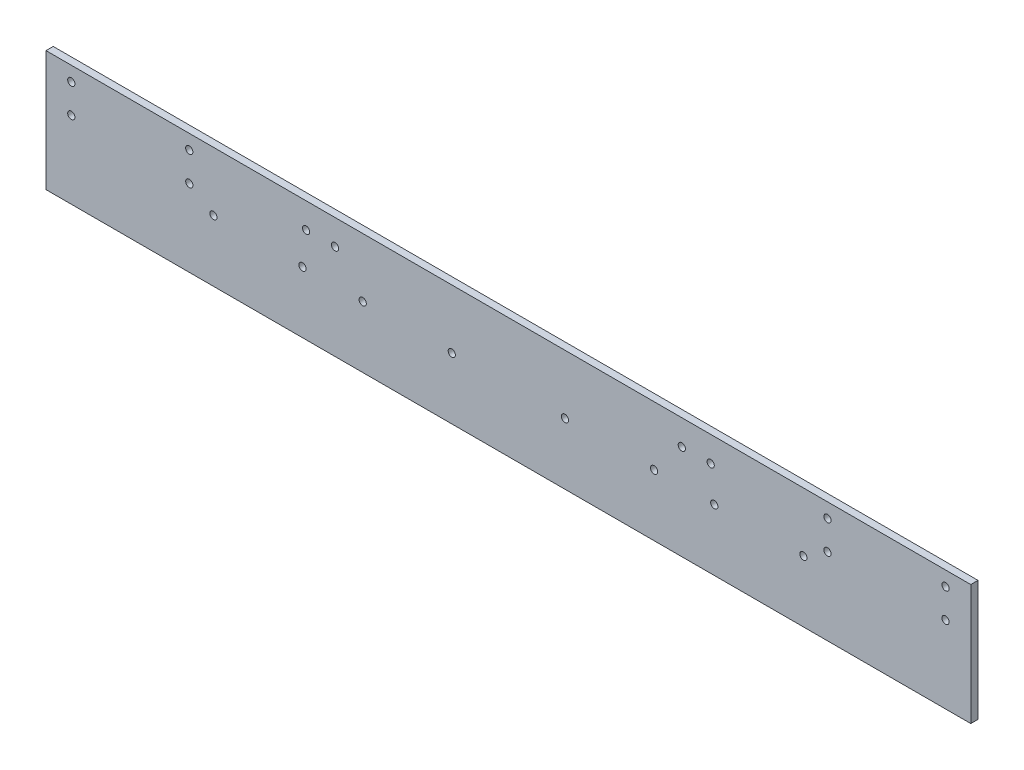
ISO-10303-21;
HEADER;
FILE_DESCRIPTION(('STEP AP214'),'2;1');
FILE_NAME('part.step','',(''),(''),'','','');
FILE_SCHEMA(('AUTOMOTIVE_DESIGN { 1 0 10303 214 1 1 1 1 }'));
ENDSEC;
DATA;
#1=APPLICATION_CONTEXT('core data for automotive mechanical design processes');
#2=APPLICATION_PROTOCOL_DEFINITION('international standard','automotive_design',2000,#1);
#3=PRODUCT_CONTEXT('',#1,'mechanical');
#4=PRODUCT('Part','Part','',(#3));
#5=PRODUCT_RELATED_PRODUCT_CATEGORY('part','',(#4));
#6=PRODUCT_DEFINITION_FORMATION('','',#4);
#7=PRODUCT_DEFINITION_CONTEXT('part definition',#1,'design');
#8=PRODUCT_DEFINITION('design','',#6,#7);
#9=PRODUCT_DEFINITION_SHAPE('','',#8);
#10=(LENGTH_UNIT() NAMED_UNIT(*) SI_UNIT(.MILLI.,.METRE.));
#11=(NAMED_UNIT(*) PLANE_ANGLE_UNIT() SI_UNIT($,.RADIAN.));
#12=(NAMED_UNIT(*) SI_UNIT($,.STERADIAN.) SOLID_ANGLE_UNIT());
#13=UNCERTAINTY_MEASURE_WITH_UNIT(LENGTH_MEASURE(1.E-05),#10,'distance_accuracy_value','');
#14=(GEOMETRIC_REPRESENTATION_CONTEXT(3) GLOBAL_UNCERTAINTY_ASSIGNED_CONTEXT((#13)) GLOBAL_UNIT_ASSIGNED_CONTEXT((#10,
#11,#12)) REPRESENTATION_CONTEXT('',''));
#15=CARTESIAN_POINT('',(0.,0.,0.));
#16=DIRECTION('',(0.,0.,1.));
#17=DIRECTION('',(1.,0.,0.));
#18=AXIS2_PLACEMENT_3D('',#15,#16,#17);
#19=CARTESIAN_POINT('',(0.,0.,3.));
#20=DIRECTION('',(1.,0.,0.));
#21=DIRECTION('',(0.,0.,-1.));
#22=AXIS2_PLACEMENT_3D('',#19,#20,#21);
#23=PLANE('',#22);
#24=DIRECTION('',(0.,-1.,0.));
#25=VECTOR('',#24,1.);
#26=CARTESIAN_POINT('',(0.,0.,0.));
#27=LINE('',#26,#25);
#28=CARTESIAN_POINT('',(0.,50.,0.));
#29=VERTEX_POINT('',#28);
#30=CARTESIAN_POINT('',(0.,0.,0.));
#31=VERTEX_POINT('',#30);
#32=EDGE_CURVE('E97',#29,#31,#27,.T.);
#33=ORIENTED_EDGE('',*,*,#32,.T.);
#34=DIRECTION('',(0.,0.,-1.));
#35=VECTOR('',#34,1.);
#36=CARTESIAN_POINT('',(0.,0.,3.));
#37=LINE('',#36,#35);
#38=CARTESIAN_POINT('',(0.,0.,3.));
#39=VERTEX_POINT('',#38);
#40=EDGE_CURVE('E11',#39,#31,#37,.T.);
#41=ORIENTED_EDGE('',*,*,#40,.F.);
#42=DIRECTION('',(0.,-1.,0.));
#43=VECTOR('',#42,1.);
#44=CARTESIAN_POINT('',(0.,0.,3.));
#45=LINE('',#44,#43);
#46=CARTESIAN_POINT('',(0.,50.,3.));
#47=VERTEX_POINT('',#46);
#48=EDGE_CURVE('E85',#47,#39,#45,.T.);
#49=ORIENTED_EDGE('',*,*,#48,.F.);
#50=DIRECTION('',(0.,0.,-1.));
#51=VECTOR('',#50,1.);
#52=CARTESIAN_POINT('',(0.,50.,3.));
#53=LINE('',#52,#51);
#54=EDGE_CURVE('E93',#47,#29,#53,.T.);
#55=ORIENTED_EDGE('',*,*,#54,.T.);
#56=EDGE_LOOP('',(#33,#41,#49,#55));
#57=FACE_BOUND('',#56,.T.);
#58=ADVANCED_FACE('F34',(#57),#23,.F.);
#59=CARTESIAN_POINT('',(0.,0.,3.));
#60=DIRECTION('',(0.,1.,0.));
#61=DIRECTION('',(0.,0.,1.));
#62=AXIS2_PLACEMENT_3D('',#59,#60,#61);
#63=PLANE('',#62);
#64=DIRECTION('',(1.,0.,0.));
#65=VECTOR('',#64,1.);
#66=CARTESIAN_POINT('',(0.,0.,0.));
#67=LINE('',#66,#65);
#68=CARTESIAN_POINT('',(384.,0.,0.));
#69=VERTEX_POINT('',#68);
#70=EDGE_CURVE('E89',#31,#69,#67,.T.);
#71=ORIENTED_EDGE('',*,*,#70,.T.);
#72=DIRECTION('',(0.,0.,-1.));
#73=VECTOR('',#72,1.);
#74=CARTESIAN_POINT('',(384.,0.,3.));
#75=LINE('',#74,#73);
#76=CARTESIAN_POINT('',(384.,0.,3.));
#77=VERTEX_POINT('',#76);
#78=EDGE_CURVE('E42',#77,#69,#75,.T.);
#79=ORIENTED_EDGE('',*,*,#78,.F.);
#80=DIRECTION('',(1.,0.,0.));
#81=VECTOR('',#80,1.);
#82=CARTESIAN_POINT('',(0.,0.,3.));
#83=LINE('',#82,#81);
#84=EDGE_CURVE('E80',#39,#77,#83,.T.);
#85=ORIENTED_EDGE('',*,*,#84,.F.);
#86=ORIENTED_EDGE('',*,*,#40,.T.);
#87=EDGE_LOOP('',(#71,#79,#85,#86));
#88=FACE_BOUND('',#87,.T.);
#89=ADVANCED_FACE('F88',(#88),#63,.F.);
#90=CARTESIAN_POINT('',(384.,0.,3.));
#91=DIRECTION('',(-1.,0.,0.));
#92=DIRECTION('',(0.,0.,1.));
#93=AXIS2_PLACEMENT_3D('',#90,#91,#92);
#94=PLANE('',#93);
#95=DIRECTION('',(0.,1.,0.));
#96=VECTOR('',#95,1.);
#97=CARTESIAN_POINT('',(384.,0.,0.));
#98=LINE('',#97,#96);
#99=CARTESIAN_POINT('',(384.,50.,0.));
#100=VERTEX_POINT('',#99);
#101=EDGE_CURVE('E67',#69,#100,#98,.T.);
#102=ORIENTED_EDGE('',*,*,#101,.T.);
#103=DIRECTION('',(0.,0.,-1.));
#104=VECTOR('',#103,1.);
#105=CARTESIAN_POINT('',(384.,50.,3.));
#106=LINE('',#105,#104);
#107=CARTESIAN_POINT('',(384.,50.,3.));
#108=VERTEX_POINT('',#107);
#109=EDGE_CURVE('E90',#108,#100,#106,.T.);
#110=ORIENTED_EDGE('',*,*,#109,.F.);
#111=DIRECTION('',(0.,1.,0.));
#112=VECTOR('',#111,1.);
#113=CARTESIAN_POINT('',(384.,0.,3.));
#114=LINE('',#113,#112);
#115=EDGE_CURVE('E83',#77,#108,#114,.T.);
#116=ORIENTED_EDGE('',*,*,#115,.F.);
#117=ORIENTED_EDGE('',*,*,#78,.T.);
#118=EDGE_LOOP('',(#102,#110,#116,#117));
#119=FACE_BOUND('',#118,.T.);
#120=ADVANCED_FACE('F91',(#119),#94,.F.);
#121=CARTESIAN_POINT('',(0.,50.,3.));
#122=DIRECTION('',(0.,-1.,0.));
#123=DIRECTION('',(1.,0.,0.));
#124=AXIS2_PLACEMENT_3D('',#121,#122,#123);
#125=PLANE('',#124);
#126=DIRECTION('',(-1.,0.,0.));
#127=VECTOR('',#126,1.);
#128=CARTESIAN_POINT('',(0.,50.,0.));
#129=LINE('',#128,#127);
#130=EDGE_CURVE('E73',#100,#29,#129,.T.);
#131=ORIENTED_EDGE('',*,*,#130,.T.);
#132=ORIENTED_EDGE('',*,*,#54,.F.);
#133=DIRECTION('',(-1.,0.,0.));
#134=VECTOR('',#133,1.);
#135=CARTESIAN_POINT('',(0.,50.,3.));
#136=LINE('',#135,#134);
#137=EDGE_CURVE('E50',#108,#47,#136,.T.);
#138=ORIENTED_EDGE('',*,*,#137,.F.);
#139=ORIENTED_EDGE('',*,*,#109,.T.);
#140=EDGE_LOOP('',(#131,#132,#138,#139));
#141=FACE_BOUND('',#140,.T.);
#142=ADVANCED_FACE('F105',(#141),#125,.F.);
#143=CARTESIAN_POINT('',(0.,0.,3.));
#144=DIRECTION('',(0.,0.,-1.));
#145=DIRECTION('',(-1.,0.,0.));
#146=AXIS2_PLACEMENT_3D('',#143,#144,#145);
#147=PLANE('',#146);
#148=CARTESIAN_POINT('',(59.5,32.0000000000001,3.));
#149=DIRECTION('',(0.,0.,1.));
#150=DIRECTION('',(-1.,0.,0.));
#151=AXIS2_PLACEMENT_3D('',#148,#149,#150);
#152=CIRCLE('',#151,1.50000000000002);
#153=CARTESIAN_POINT('',(58.,32.0000000000001,3.));
#154=VERTEX_POINT('',#153);
#155=EDGE_CURVE('E225',#154,#154,#152,.T.);
#156=ORIENTED_EDGE('',*,*,#155,.F.);
#157=EDGE_LOOP('',(#156));
#158=FACE_BOUND('',#157,.T.);
#159=CARTESIAN_POINT('',(10.5,32.0000000000001,3.));
#160=DIRECTION('',(0.,0.,1.));
#161=DIRECTION('',(-1.,0.,0.));
#162=AXIS2_PLACEMENT_3D('',#159,#160,#161);
#163=CIRCLE('',#162,1.50000000000002);
#164=CARTESIAN_POINT('',(8.99999999999999,32.0000000000001,3.));
#165=VERTEX_POINT('',#164);
#166=EDGE_CURVE('E219',#165,#165,#163,.T.);
#167=ORIENTED_EDGE('',*,*,#166,.F.);
#168=EDGE_LOOP('',(#167));
#169=FACE_BOUND('',#168,.T.);
#170=CARTESIAN_POINT('',(10.5,44.0000000000001,3.));
#171=DIRECTION('',(0.,0.,1.));
#172=DIRECTION('',(-1.,0.,0.));
#173=AXIS2_PLACEMENT_3D('',#170,#171,#172);
#174=CIRCLE('',#173,1.50000000000002);
#175=CARTESIAN_POINT('',(8.99999999999999,44.0000000000001,3.));
#176=VERTEX_POINT('',#175);
#177=EDGE_CURVE('E213',#176,#176,#174,.T.);
#178=ORIENTED_EDGE('',*,*,#177,.F.);
#179=EDGE_LOOP('',(#178));
#180=FACE_BOUND('',#179,.T.);
#181=CARTESIAN_POINT('',(59.5,44.0000000000001,3.));
#182=DIRECTION('',(0.,0.,1.));
#183=DIRECTION('',(-1.,0.,0.));
#184=AXIS2_PLACEMENT_3D('',#181,#182,#183);
#185=CIRCLE('',#184,1.50000000000002);
#186=CARTESIAN_POINT('',(58.,44.0000000000001,3.));
#187=VERTEX_POINT('',#186);
#188=EDGE_CURVE('E207',#187,#187,#185,.T.);
#189=ORIENTED_EDGE('',*,*,#188,.F.);
#190=EDGE_LOOP('',(#189));
#191=FACE_BOUND('',#190,.T.);
#192=CARTESIAN_POINT('',(324.5,32.0000000000001,3.));
#193=DIRECTION('',(0.,0.,1.));
#194=DIRECTION('',(1.,0.,0.));
#195=AXIS2_PLACEMENT_3D('',#192,#193,#194);
#196=CIRCLE('',#195,1.50000000000002);
#197=CARTESIAN_POINT('',(326.,32.0000000000001,3.));
#198=VERTEX_POINT('',#197);
#199=EDGE_CURVE('E201',#198,#198,#196,.T.);
#200=ORIENTED_EDGE('',*,*,#199,.F.);
#201=EDGE_LOOP('',(#200));
#202=FACE_BOUND('',#201,.T.);
#203=CARTESIAN_POINT('',(324.5,44.0000000000001,3.));
#204=DIRECTION('',(0.,0.,1.));
#205=DIRECTION('',(1.,0.,0.));
#206=AXIS2_PLACEMENT_3D('',#203,#204,#205);
#207=CIRCLE('',#206,1.50000000000002);
#208=CARTESIAN_POINT('',(326.,44.0000000000001,3.));
#209=VERTEX_POINT('',#208);
#210=EDGE_CURVE('E195',#209,#209,#207,.T.);
#211=ORIENTED_EDGE('',*,*,#210,.F.);
#212=EDGE_LOOP('',(#211));
#213=FACE_BOUND('',#212,.T.);
#214=CARTESIAN_POINT('',(373.5,32.0000000000001,3.));
#215=DIRECTION('',(0.,0.,1.));
#216=DIRECTION('',(1.,0.,0.));
#217=AXIS2_PLACEMENT_3D('',#214,#215,#216);
#218=CIRCLE('',#217,1.50000000000002);
#219=CARTESIAN_POINT('',(375.,32.0000000000001,3.));
#220=VERTEX_POINT('',#219);
#221=EDGE_CURVE('E189',#220,#220,#218,.T.);
#222=ORIENTED_EDGE('',*,*,#221,.F.);
#223=EDGE_LOOP('',(#222));
#224=FACE_BOUND('',#223,.T.);
#225=CARTESIAN_POINT('',(373.5,44.0000000000001,3.));
#226=DIRECTION('',(0.,0.,1.));
#227=DIRECTION('',(1.,0.,0.));
#228=AXIS2_PLACEMENT_3D('',#225,#226,#227);
#229=CIRCLE('',#228,1.50000000000002);
#230=CARTESIAN_POINT('',(375.,44.0000000000001,3.));
#231=VERTEX_POINT('',#230);
#232=EDGE_CURVE('E183',#231,#231,#229,.T.);
#233=ORIENTED_EDGE('',*,*,#232,.F.);
#234=EDGE_LOOP('',(#233));
#235=FACE_BOUND('',#234,.T.);
#236=CARTESIAN_POINT('',(168.5,25.5,3.));
#237=DIRECTION('',(0.,0.,1.));
#238=DIRECTION('',(-1.,0.,0.));
#239=AXIS2_PLACEMENT_3D('',#236,#237,#238);
#240=CIRCLE('',#239,1.5);
#241=CARTESIAN_POINT('',(167.,25.5,3.));
#242=VERTEX_POINT('',#241);
#243=EDGE_CURVE('E177',#242,#242,#240,.T.);
#244=ORIENTED_EDGE('',*,*,#243,.F.);
#245=EDGE_LOOP('',(#244));
#246=FACE_BOUND('',#245,.T.);
#247=CARTESIAN_POINT('',(131.5,25.5,3.));
#248=DIRECTION('',(0.,0.,1.));
#249=DIRECTION('',(-1.,0.,0.));
#250=AXIS2_PLACEMENT_3D('',#247,#248,#249);
#251=CIRCLE('',#250,1.5);
#252=CARTESIAN_POINT('',(130.,25.5,3.));
#253=VERTEX_POINT('',#252);
#254=EDGE_CURVE('E171',#253,#253,#251,.T.);
#255=ORIENTED_EDGE('',*,*,#254,.F.);
#256=EDGE_LOOP('',(#255));
#257=FACE_BOUND('',#256,.T.);
#258=CARTESIAN_POINT('',(106.5,25.5,3.));
#259=DIRECTION('',(0.,0.,1.));
#260=DIRECTION('',(-1.,0.,0.));
#261=AXIS2_PLACEMENT_3D('',#258,#259,#260);
#262=CIRCLE('',#261,1.50000000000003);
#263=CARTESIAN_POINT('',(105.,25.5,3.));
#264=VERTEX_POINT('',#263);
#265=EDGE_CURVE('E165',#264,#264,#262,.T.);
#266=ORIENTED_EDGE('',*,*,#265,.F.);
#267=EDGE_LOOP('',(#266));
#268=FACE_BOUND('',#267,.T.);
#269=CARTESIAN_POINT('',(69.5,25.5,3.));
#270=DIRECTION('',(0.,0.,1.));
#271=DIRECTION('',(-1.,0.,0.));
#272=AXIS2_PLACEMENT_3D('',#269,#270,#271);
#273=CIRCLE('',#272,1.50000000000003);
#274=CARTESIAN_POINT('',(68.,25.5,3.));
#275=VERTEX_POINT('',#274);
#276=EDGE_CURVE('E159',#275,#275,#273,.T.);
#277=ORIENTED_EDGE('',*,*,#276,.F.);
#278=EDGE_LOOP('',(#277));
#279=FACE_BOUND('',#278,.T.);
#280=CARTESIAN_POINT('',(314.5,25.5,3.));
#281=DIRECTION('',(0.,0.,1.));
#282=DIRECTION('',(1.,0.,0.));
#283=AXIS2_PLACEMENT_3D('',#280,#281,#282);
#284=CIRCLE('',#283,1.50000000000002);
#285=CARTESIAN_POINT('',(316.,25.5,3.));
#286=VERTEX_POINT('',#285);
#287=EDGE_CURVE('E153',#286,#286,#284,.T.);
#288=ORIENTED_EDGE('',*,*,#287,.F.);
#289=EDGE_LOOP('',(#288));
#290=FACE_BOUND('',#289,.T.);
#291=CARTESIAN_POINT('',(277.5,25.5,3.));
#292=DIRECTION('',(0.,0.,1.));
#293=DIRECTION('',(1.,0.,0.));
#294=AXIS2_PLACEMENT_3D('',#291,#292,#293);
#295=CIRCLE('',#294,1.50000000000002);
#296=CARTESIAN_POINT('',(279.,25.5,3.));
#297=VERTEX_POINT('',#296);
#298=EDGE_CURVE('E147',#297,#297,#295,.T.);
#299=ORIENTED_EDGE('',*,*,#298,.F.);
#300=EDGE_LOOP('',(#299));
#301=FACE_BOUND('',#300,.T.);
#302=CARTESIAN_POINT('',(252.5,25.5,3.));
#303=DIRECTION('',(0.,0.,1.));
#304=DIRECTION('',(1.,0.,0.));
#305=AXIS2_PLACEMENT_3D('',#302,#303,#304);
#306=CIRCLE('',#305,1.50000000000002);
#307=CARTESIAN_POINT('',(254.,25.5,3.));
#308=VERTEX_POINT('',#307);
#309=EDGE_CURVE('E141',#308,#308,#306,.T.);
#310=ORIENTED_EDGE('',*,*,#309,.F.);
#311=EDGE_LOOP('',(#310));
#312=FACE_BOUND('',#311,.T.);
#313=CARTESIAN_POINT('',(215.5,25.5,3.));
#314=DIRECTION('',(0.,0.,1.));
#315=DIRECTION('',(1.,0.,0.));
#316=AXIS2_PLACEMENT_3D('',#313,#314,#315);
#317=CIRCLE('',#316,1.5);
#318=CARTESIAN_POINT('',(217.,25.5,3.));
#319=VERTEX_POINT('',#318);
#320=EDGE_CURVE('E135',#319,#319,#317,.T.);
#321=ORIENTED_EDGE('',*,*,#320,.F.);
#322=EDGE_LOOP('',(#321));
#323=FACE_BOUND('',#322,.T.);
#324=CARTESIAN_POINT('',(108.,39.5,3.));
#325=DIRECTION('',(0.,0.,1.));
#326=DIRECTION('',(1.,0.,0.));
#327=AXIS2_PLACEMENT_3D('',#324,#325,#326);
#328=CIRCLE('',#327,1.5);
#329=CARTESIAN_POINT('',(109.5,39.5,3.));
#330=VERTEX_POINT('',#329);
#331=EDGE_CURVE('E129',#330,#330,#328,.T.);
#332=ORIENTED_EDGE('',*,*,#331,.F.);
#333=EDGE_LOOP('',(#332));
#334=FACE_BOUND('',#333,.T.);
#335=CARTESIAN_POINT('',(120.,39.5,3.));
#336=DIRECTION('',(0.,0.,1.));
#337=DIRECTION('',(1.,0.,0.));
#338=AXIS2_PLACEMENT_3D('',#335,#336,#337);
#339=CIRCLE('',#338,1.5);
#340=CARTESIAN_POINT('',(121.5,39.5,3.));
#341=VERTEX_POINT('',#340);
#342=EDGE_CURVE('E123',#341,#341,#339,.T.);
#343=ORIENTED_EDGE('',*,*,#342,.F.);
#344=EDGE_LOOP('',(#343));
#345=FACE_BOUND('',#344,.T.);
#346=CARTESIAN_POINT('',(276.,39.5,3.));
#347=DIRECTION('',(0.,0.,1.));
#348=DIRECTION('',(1.,0.,0.));
#349=AXIS2_PLACEMENT_3D('',#346,#347,#348);
#350=CIRCLE('',#349,1.50000000000002);
#351=CARTESIAN_POINT('',(277.5,39.5,3.));
#352=VERTEX_POINT('',#351);
#353=EDGE_CURVE('E117',#352,#352,#350,.T.);
#354=ORIENTED_EDGE('',*,*,#353,.F.);
#355=EDGE_LOOP('',(#354));
#356=FACE_BOUND('',#355,.T.);
#357=CARTESIAN_POINT('',(264.,39.5,3.));
#358=DIRECTION('',(0.,0.,1.));
#359=DIRECTION('',(1.,0.,0.));
#360=AXIS2_PLACEMENT_3D('',#357,#358,#359);
#361=CIRCLE('',#360,1.50000000000002);
#362=CARTESIAN_POINT('',(265.5,39.5,3.));
#363=VERTEX_POINT('',#362);
#364=EDGE_CURVE('E111',#363,#363,#361,.T.);
#365=ORIENTED_EDGE('',*,*,#364,.F.);
#366=EDGE_LOOP('',(#365));
#367=FACE_BOUND('',#366,.T.);
#368=ORIENTED_EDGE('',*,*,#48,.T.);
#369=ORIENTED_EDGE('',*,*,#84,.T.);
#370=ORIENTED_EDGE('',*,*,#115,.T.);
#371=ORIENTED_EDGE('',*,*,#137,.T.);
#372=EDGE_LOOP('',(#368,#369,#370,#371));
#373=FACE_BOUND('',#372,.T.);
#374=ADVANCED_FACE('F81',(#158,#169,#180,#191,#202,#213,#224,#235,#246,#257,#268,#279,#290,#301,
#312,#323,#334,#345,#356,#367,#373),#147,.F.);
#375=CARTESIAN_POINT('',(0.,0.,0.));
#376=DIRECTION('',(0.,0.,-1.));
#377=DIRECTION('',(-1.,0.,0.));
#378=AXIS2_PLACEMENT_3D('',#375,#376,#377);
#379=PLANE('',#378);
#380=CARTESIAN_POINT('',(59.5,32.0000000000001,0.));
#381=DIRECTION('',(0.,0.,1.));
#382=DIRECTION('',(-1.,0.,0.));
#383=AXIS2_PLACEMENT_3D('',#380,#381,#382);
#384=CIRCLE('',#383,1.50000000000002);
#385=CARTESIAN_POINT('',(58.,32.0000000000001,0.));
#386=VERTEX_POINT('',#385);
#387=EDGE_CURVE('E222',#386,#386,#384,.T.);
#388=ORIENTED_EDGE('',*,*,#387,.T.);
#389=EDGE_LOOP('',(#388));
#390=FACE_BOUND('',#389,.T.);
#391=CARTESIAN_POINT('',(10.5,32.0000000000001,0.));
#392=DIRECTION('',(0.,0.,1.));
#393=DIRECTION('',(-1.,0.,0.));
#394=AXIS2_PLACEMENT_3D('',#391,#392,#393);
#395=CIRCLE('',#394,1.50000000000002);
#396=CARTESIAN_POINT('',(8.99999999999999,32.0000000000001,0.));
#397=VERTEX_POINT('',#396);
#398=EDGE_CURVE('E216',#397,#397,#395,.T.);
#399=ORIENTED_EDGE('',*,*,#398,.T.);
#400=EDGE_LOOP('',(#399));
#401=FACE_BOUND('',#400,.T.);
#402=CARTESIAN_POINT('',(10.5,44.0000000000001,0.));
#403=DIRECTION('',(0.,0.,1.));
#404=DIRECTION('',(-1.,0.,0.));
#405=AXIS2_PLACEMENT_3D('',#402,#403,#404);
#406=CIRCLE('',#405,1.50000000000002);
#407=CARTESIAN_POINT('',(8.99999999999999,44.0000000000001,0.));
#408=VERTEX_POINT('',#407);
#409=EDGE_CURVE('E210',#408,#408,#406,.T.);
#410=ORIENTED_EDGE('',*,*,#409,.T.);
#411=EDGE_LOOP('',(#410));
#412=FACE_BOUND('',#411,.T.);
#413=CARTESIAN_POINT('',(59.5,44.0000000000001,0.));
#414=DIRECTION('',(0.,0.,1.));
#415=DIRECTION('',(-1.,0.,0.));
#416=AXIS2_PLACEMENT_3D('',#413,#414,#415);
#417=CIRCLE('',#416,1.50000000000002);
#418=CARTESIAN_POINT('',(58.,44.0000000000001,0.));
#419=VERTEX_POINT('',#418);
#420=EDGE_CURVE('E204',#419,#419,#417,.T.);
#421=ORIENTED_EDGE('',*,*,#420,.T.);
#422=EDGE_LOOP('',(#421));
#423=FACE_BOUND('',#422,.T.);
#424=CARTESIAN_POINT('',(324.5,32.0000000000001,0.));
#425=DIRECTION('',(0.,0.,1.));
#426=DIRECTION('',(1.,0.,0.));
#427=AXIS2_PLACEMENT_3D('',#424,#425,#426);
#428=CIRCLE('',#427,1.50000000000002);
#429=CARTESIAN_POINT('',(326.,32.0000000000001,0.));
#430=VERTEX_POINT('',#429);
#431=EDGE_CURVE('E198',#430,#430,#428,.T.);
#432=ORIENTED_EDGE('',*,*,#431,.T.);
#433=EDGE_LOOP('',(#432));
#434=FACE_BOUND('',#433,.T.);
#435=CARTESIAN_POINT('',(324.5,44.0000000000001,0.));
#436=DIRECTION('',(0.,0.,1.));
#437=DIRECTION('',(1.,0.,0.));
#438=AXIS2_PLACEMENT_3D('',#435,#436,#437);
#439=CIRCLE('',#438,1.50000000000002);
#440=CARTESIAN_POINT('',(326.,44.0000000000001,0.));
#441=VERTEX_POINT('',#440);
#442=EDGE_CURVE('E192',#441,#441,#439,.T.);
#443=ORIENTED_EDGE('',*,*,#442,.T.);
#444=EDGE_LOOP('',(#443));
#445=FACE_BOUND('',#444,.T.);
#446=CARTESIAN_POINT('',(373.5,32.0000000000001,0.));
#447=DIRECTION('',(0.,0.,1.));
#448=DIRECTION('',(1.,0.,0.));
#449=AXIS2_PLACEMENT_3D('',#446,#447,#448);
#450=CIRCLE('',#449,1.50000000000002);
#451=CARTESIAN_POINT('',(375.,32.0000000000001,0.));
#452=VERTEX_POINT('',#451);
#453=EDGE_CURVE('E186',#452,#452,#450,.T.);
#454=ORIENTED_EDGE('',*,*,#453,.T.);
#455=EDGE_LOOP('',(#454));
#456=FACE_BOUND('',#455,.T.);
#457=CARTESIAN_POINT('',(373.5,44.0000000000001,0.));
#458=DIRECTION('',(0.,0.,1.));
#459=DIRECTION('',(1.,0.,0.));
#460=AXIS2_PLACEMENT_3D('',#457,#458,#459);
#461=CIRCLE('',#460,1.50000000000002);
#462=CARTESIAN_POINT('',(375.,44.0000000000001,0.));
#463=VERTEX_POINT('',#462);
#464=EDGE_CURVE('E180',#463,#463,#461,.T.);
#465=ORIENTED_EDGE('',*,*,#464,.T.);
#466=EDGE_LOOP('',(#465));
#467=FACE_BOUND('',#466,.T.);
#468=CARTESIAN_POINT('',(168.5,25.5,0.));
#469=DIRECTION('',(0.,0.,1.));
#470=DIRECTION('',(-1.,0.,0.));
#471=AXIS2_PLACEMENT_3D('',#468,#469,#470);
#472=CIRCLE('',#471,1.5);
#473=CARTESIAN_POINT('',(167.,25.5,0.));
#474=VERTEX_POINT('',#473);
#475=EDGE_CURVE('E174',#474,#474,#472,.T.);
#476=ORIENTED_EDGE('',*,*,#475,.T.);
#477=EDGE_LOOP('',(#476));
#478=FACE_BOUND('',#477,.T.);
#479=CARTESIAN_POINT('',(131.5,25.5,0.));
#480=DIRECTION('',(0.,0.,1.));
#481=DIRECTION('',(-1.,0.,0.));
#482=AXIS2_PLACEMENT_3D('',#479,#480,#481);
#483=CIRCLE('',#482,1.5);
#484=CARTESIAN_POINT('',(130.,25.5,0.));
#485=VERTEX_POINT('',#484);
#486=EDGE_CURVE('E168',#485,#485,#483,.T.);
#487=ORIENTED_EDGE('',*,*,#486,.T.);
#488=EDGE_LOOP('',(#487));
#489=FACE_BOUND('',#488,.T.);
#490=CARTESIAN_POINT('',(106.5,25.5,0.));
#491=DIRECTION('',(0.,0.,1.));
#492=DIRECTION('',(-1.,0.,0.));
#493=AXIS2_PLACEMENT_3D('',#490,#491,#492);
#494=CIRCLE('',#493,1.50000000000003);
#495=CARTESIAN_POINT('',(105.,25.5,0.));
#496=VERTEX_POINT('',#495);
#497=EDGE_CURVE('E162',#496,#496,#494,.T.);
#498=ORIENTED_EDGE('',*,*,#497,.T.);
#499=EDGE_LOOP('',(#498));
#500=FACE_BOUND('',#499,.T.);
#501=CARTESIAN_POINT('',(69.5,25.5,0.));
#502=DIRECTION('',(0.,0.,1.));
#503=DIRECTION('',(-1.,0.,0.));
#504=AXIS2_PLACEMENT_3D('',#501,#502,#503);
#505=CIRCLE('',#504,1.50000000000003);
#506=CARTESIAN_POINT('',(68.,25.5,0.));
#507=VERTEX_POINT('',#506);
#508=EDGE_CURVE('E156',#507,#507,#505,.T.);
#509=ORIENTED_EDGE('',*,*,#508,.T.);
#510=EDGE_LOOP('',(#509));
#511=FACE_BOUND('',#510,.T.);
#512=CARTESIAN_POINT('',(314.5,25.5,0.));
#513=DIRECTION('',(0.,0.,1.));
#514=DIRECTION('',(1.,0.,0.));
#515=AXIS2_PLACEMENT_3D('',#512,#513,#514);
#516=CIRCLE('',#515,1.50000000000002);
#517=CARTESIAN_POINT('',(316.,25.5,0.));
#518=VERTEX_POINT('',#517);
#519=EDGE_CURVE('E150',#518,#518,#516,.T.);
#520=ORIENTED_EDGE('',*,*,#519,.T.);
#521=EDGE_LOOP('',(#520));
#522=FACE_BOUND('',#521,.T.);
#523=CARTESIAN_POINT('',(277.5,25.5,0.));
#524=DIRECTION('',(0.,0.,1.));
#525=DIRECTION('',(1.,0.,0.));
#526=AXIS2_PLACEMENT_3D('',#523,#524,#525);
#527=CIRCLE('',#526,1.50000000000002);
#528=CARTESIAN_POINT('',(279.,25.5,0.));
#529=VERTEX_POINT('',#528);
#530=EDGE_CURVE('E144',#529,#529,#527,.T.);
#531=ORIENTED_EDGE('',*,*,#530,.T.);
#532=EDGE_LOOP('',(#531));
#533=FACE_BOUND('',#532,.T.);
#534=CARTESIAN_POINT('',(252.5,25.5,0.));
#535=DIRECTION('',(0.,0.,1.));
#536=DIRECTION('',(1.,0.,0.));
#537=AXIS2_PLACEMENT_3D('',#534,#535,#536);
#538=CIRCLE('',#537,1.50000000000002);
#539=CARTESIAN_POINT('',(254.,25.5,0.));
#540=VERTEX_POINT('',#539);
#541=EDGE_CURVE('E138',#540,#540,#538,.T.);
#542=ORIENTED_EDGE('',*,*,#541,.T.);
#543=EDGE_LOOP('',(#542));
#544=FACE_BOUND('',#543,.T.);
#545=CARTESIAN_POINT('',(215.5,25.5,0.));
#546=DIRECTION('',(0.,0.,1.));
#547=DIRECTION('',(1.,0.,0.));
#548=AXIS2_PLACEMENT_3D('',#545,#546,#547);
#549=CIRCLE('',#548,1.5);
#550=CARTESIAN_POINT('',(217.,25.5,0.));
#551=VERTEX_POINT('',#550);
#552=EDGE_CURVE('E132',#551,#551,#549,.T.);
#553=ORIENTED_EDGE('',*,*,#552,.T.);
#554=EDGE_LOOP('',(#553));
#555=FACE_BOUND('',#554,.T.);
#556=CARTESIAN_POINT('',(108.,39.5,0.));
#557=DIRECTION('',(0.,0.,1.));
#558=DIRECTION('',(1.,0.,0.));
#559=AXIS2_PLACEMENT_3D('',#556,#557,#558);
#560=CIRCLE('',#559,1.5);
#561=CARTESIAN_POINT('',(109.5,39.5,0.));
#562=VERTEX_POINT('',#561);
#563=EDGE_CURVE('E126',#562,#562,#560,.T.);
#564=ORIENTED_EDGE('',*,*,#563,.T.);
#565=EDGE_LOOP('',(#564));
#566=FACE_BOUND('',#565,.T.);
#567=CARTESIAN_POINT('',(120.,39.5,0.));
#568=DIRECTION('',(0.,0.,1.));
#569=DIRECTION('',(1.,0.,0.));
#570=AXIS2_PLACEMENT_3D('',#567,#568,#569);
#571=CIRCLE('',#570,1.5);
#572=CARTESIAN_POINT('',(121.5,39.5,0.));
#573=VERTEX_POINT('',#572);
#574=EDGE_CURVE('E120',#573,#573,#571,.T.);
#575=ORIENTED_EDGE('',*,*,#574,.T.);
#576=EDGE_LOOP('',(#575));
#577=FACE_BOUND('',#576,.T.);
#578=CARTESIAN_POINT('',(276.,39.5,0.));
#579=DIRECTION('',(0.,0.,1.));
#580=DIRECTION('',(1.,0.,0.));
#581=AXIS2_PLACEMENT_3D('',#578,#579,#580);
#582=CIRCLE('',#581,1.50000000000002);
#583=CARTESIAN_POINT('',(277.5,39.5,0.));
#584=VERTEX_POINT('',#583);
#585=EDGE_CURVE('E114',#584,#584,#582,.T.);
#586=ORIENTED_EDGE('',*,*,#585,.T.);
#587=EDGE_LOOP('',(#586));
#588=FACE_BOUND('',#587,.T.);
#589=CARTESIAN_POINT('',(264.,39.5,0.));
#590=DIRECTION('',(0.,0.,1.));
#591=DIRECTION('',(1.,0.,0.));
#592=AXIS2_PLACEMENT_3D('',#589,#590,#591);
#593=CIRCLE('',#592,1.50000000000002);
#594=CARTESIAN_POINT('',(265.5,39.5,0.));
#595=VERTEX_POINT('',#594);
#596=EDGE_CURVE('E100',#595,#595,#593,.T.);
#597=ORIENTED_EDGE('',*,*,#596,.T.);
#598=EDGE_LOOP('',(#597));
#599=FACE_BOUND('',#598,.T.);
#600=ORIENTED_EDGE('',*,*,#32,.F.);
#601=ORIENTED_EDGE('',*,*,#130,.F.);
#602=ORIENTED_EDGE('',*,*,#101,.F.);
#603=ORIENTED_EDGE('',*,*,#70,.F.);
#604=EDGE_LOOP('',(#600,#601,#602,#603));
#605=FACE_BOUND('',#604,.T.);
#606=ADVANCED_FACE('F108',(#390,#401,#412,#423,#434,#445,#456,#467,#478,#489,#500,#511,#522,
#533,#544,#555,#566,#577,#588,#599,#605),#379,.T.);
#607=CARTESIAN_POINT('',(264.,39.5,0.));
#608=DIRECTION('',(0.,0.,1.));
#609=DIRECTION('',(1.,0.,0.));
#610=AXIS2_PLACEMENT_3D('',#607,#608,#609);
#611=CYLINDRICAL_SURFACE('',#610,1.50000000000002);
#612=ORIENTED_EDGE('',*,*,#596,.F.);
#613=EDGE_LOOP('',(#612));
#614=FACE_BOUND('',#613,.T.);
#615=ORIENTED_EDGE('',*,*,#364,.T.);
#616=EDGE_LOOP('',(#615));
#617=FACE_BOUND('',#616,.T.);
#618=ADVANCED_FACE('F281',(#614,#617),#611,.F.);
#619=CARTESIAN_POINT('',(276.,39.5,0.));
#620=DIRECTION('',(0.,0.,1.));
#621=DIRECTION('',(1.,0.,0.));
#622=AXIS2_PLACEMENT_3D('',#619,#620,#621);
#623=CYLINDRICAL_SURFACE('',#622,1.50000000000002);
#624=ORIENTED_EDGE('',*,*,#585,.F.);
#625=EDGE_LOOP('',(#624));
#626=FACE_BOUND('',#625,.T.);
#627=ORIENTED_EDGE('',*,*,#353,.T.);
#628=EDGE_LOOP('',(#627));
#629=FACE_BOUND('',#628,.T.);
#630=ADVANCED_FACE('F283',(#626,#629),#623,.F.);
#631=CARTESIAN_POINT('',(120.,39.5,0.));
#632=DIRECTION('',(0.,0.,1.));
#633=DIRECTION('',(1.,0.,0.));
#634=AXIS2_PLACEMENT_3D('',#631,#632,#633);
#635=CYLINDRICAL_SURFACE('',#634,1.5);
#636=ORIENTED_EDGE('',*,*,#574,.F.);
#637=EDGE_LOOP('',(#636));
#638=FACE_BOUND('',#637,.T.);
#639=ORIENTED_EDGE('',*,*,#342,.T.);
#640=EDGE_LOOP('',(#639));
#641=FACE_BOUND('',#640,.T.);
#642=ADVANCED_FACE('F290',(#638,#641),#635,.F.);
#643=CARTESIAN_POINT('',(108.,39.5,0.));
#644=DIRECTION('',(0.,0.,1.));
#645=DIRECTION('',(1.,0.,0.));
#646=AXIS2_PLACEMENT_3D('',#643,#644,#645);
#647=CYLINDRICAL_SURFACE('',#646,1.5);
#648=ORIENTED_EDGE('',*,*,#563,.F.);
#649=EDGE_LOOP('',(#648));
#650=FACE_BOUND('',#649,.T.);
#651=ORIENTED_EDGE('',*,*,#331,.T.);
#652=EDGE_LOOP('',(#651));
#653=FACE_BOUND('',#652,.T.);
#654=ADVANCED_FACE('F336',(#650,#653),#647,.F.);
#655=CARTESIAN_POINT('',(215.5,25.5,0.));
#656=DIRECTION('',(0.,0.,1.));
#657=DIRECTION('',(1.,0.,0.));
#658=AXIS2_PLACEMENT_3D('',#655,#656,#657);
#659=CYLINDRICAL_SURFACE('',#658,1.5);
#660=ORIENTED_EDGE('',*,*,#552,.F.);
#661=EDGE_LOOP('',(#660));
#662=FACE_BOUND('',#661,.T.);
#663=ORIENTED_EDGE('',*,*,#320,.T.);
#664=EDGE_LOOP('',(#663));
#665=FACE_BOUND('',#664,.T.);
#666=ADVANCED_FACE('F346',(#662,#665),#659,.F.);
#667=CARTESIAN_POINT('',(252.5,25.5,0.));
#668=DIRECTION('',(0.,0.,1.));
#669=DIRECTION('',(1.,0.,0.));
#670=AXIS2_PLACEMENT_3D('',#667,#668,#669);
#671=CYLINDRICAL_SURFACE('',#670,1.50000000000002);
#672=ORIENTED_EDGE('',*,*,#541,.F.);
#673=EDGE_LOOP('',(#672));
#674=FACE_BOUND('',#673,.T.);
#675=ORIENTED_EDGE('',*,*,#309,.T.);
#676=EDGE_LOOP('',(#675));
#677=FACE_BOUND('',#676,.T.);
#678=ADVANCED_FACE('F356',(#674,#677),#671,.F.);
#679=CARTESIAN_POINT('',(277.5,25.5,0.));
#680=DIRECTION('',(0.,0.,1.));
#681=DIRECTION('',(1.,0.,0.));
#682=AXIS2_PLACEMENT_3D('',#679,#680,#681);
#683=CYLINDRICAL_SURFACE('',#682,1.50000000000002);
#684=ORIENTED_EDGE('',*,*,#530,.F.);
#685=EDGE_LOOP('',(#684));
#686=FACE_BOUND('',#685,.T.);
#687=ORIENTED_EDGE('',*,*,#298,.T.);
#688=EDGE_LOOP('',(#687));
#689=FACE_BOUND('',#688,.T.);
#690=ADVANCED_FACE('F366',(#686,#689),#683,.F.);
#691=CARTESIAN_POINT('',(314.5,25.5,0.));
#692=DIRECTION('',(0.,0.,1.));
#693=DIRECTION('',(1.,0.,0.));
#694=AXIS2_PLACEMENT_3D('',#691,#692,#693);
#695=CYLINDRICAL_SURFACE('',#694,1.50000000000002);
#696=ORIENTED_EDGE('',*,*,#519,.F.);
#697=EDGE_LOOP('',(#696));
#698=FACE_BOUND('',#697,.T.);
#699=ORIENTED_EDGE('',*,*,#287,.T.);
#700=EDGE_LOOP('',(#699));
#701=FACE_BOUND('',#700,.T.);
#702=ADVANCED_FACE('F376',(#698,#701),#695,.F.);
#703=CARTESIAN_POINT('',(69.5,25.5,0.));
#704=DIRECTION('',(0.,0.,1.));
#705=DIRECTION('',(1.,0.,0.));
#706=AXIS2_PLACEMENT_3D('',#703,#704,#705);
#707=CYLINDRICAL_SURFACE('',#706,1.50000000000003);
#708=ORIENTED_EDGE('',*,*,#508,.F.);
#709=EDGE_LOOP('',(#708));
#710=FACE_BOUND('',#709,.T.);
#711=ORIENTED_EDGE('',*,*,#276,.T.);
#712=EDGE_LOOP('',(#711));
#713=FACE_BOUND('',#712,.T.);
#714=ADVANCED_FACE('F386',(#710,#713),#707,.F.);
#715=CARTESIAN_POINT('',(106.5,25.5,0.));
#716=DIRECTION('',(0.,0.,1.));
#717=DIRECTION('',(1.,0.,0.));
#718=AXIS2_PLACEMENT_3D('',#715,#716,#717);
#719=CYLINDRICAL_SURFACE('',#718,1.50000000000003);
#720=ORIENTED_EDGE('',*,*,#497,.F.);
#721=EDGE_LOOP('',(#720));
#722=FACE_BOUND('',#721,.T.);
#723=ORIENTED_EDGE('',*,*,#265,.T.);
#724=EDGE_LOOP('',(#723));
#725=FACE_BOUND('',#724,.T.);
#726=ADVANCED_FACE('F396',(#722,#725),#719,.F.);
#727=CARTESIAN_POINT('',(131.5,25.5,0.));
#728=DIRECTION('',(0.,0.,1.));
#729=DIRECTION('',(1.,0.,0.));
#730=AXIS2_PLACEMENT_3D('',#727,#728,#729);
#731=CYLINDRICAL_SURFACE('',#730,1.5);
#732=ORIENTED_EDGE('',*,*,#486,.F.);
#733=EDGE_LOOP('',(#732));
#734=FACE_BOUND('',#733,.T.);
#735=ORIENTED_EDGE('',*,*,#254,.T.);
#736=EDGE_LOOP('',(#735));
#737=FACE_BOUND('',#736,.T.);
#738=ADVANCED_FACE('F406',(#734,#737),#731,.F.);
#739=CARTESIAN_POINT('',(168.5,25.5,0.));
#740=DIRECTION('',(0.,0.,1.));
#741=DIRECTION('',(1.,0.,0.));
#742=AXIS2_PLACEMENT_3D('',#739,#740,#741);
#743=CYLINDRICAL_SURFACE('',#742,1.5);
#744=ORIENTED_EDGE('',*,*,#475,.F.);
#745=EDGE_LOOP('',(#744));
#746=FACE_BOUND('',#745,.T.);
#747=ORIENTED_EDGE('',*,*,#243,.T.);
#748=EDGE_LOOP('',(#747));
#749=FACE_BOUND('',#748,.T.);
#750=ADVANCED_FACE('F416',(#746,#749),#743,.F.);
#751=CARTESIAN_POINT('',(373.5,44.0000000000001,0.));
#752=DIRECTION('',(0.,0.,1.));
#753=DIRECTION('',(1.,0.,0.));
#754=AXIS2_PLACEMENT_3D('',#751,#752,#753);
#755=CYLINDRICAL_SURFACE('',#754,1.50000000000002);
#756=ORIENTED_EDGE('',*,*,#464,.F.);
#757=EDGE_LOOP('',(#756));
#758=FACE_BOUND('',#757,.T.);
#759=ORIENTED_EDGE('',*,*,#232,.T.);
#760=EDGE_LOOP('',(#759));
#761=FACE_BOUND('',#760,.T.);
#762=ADVANCED_FACE('F426',(#758,#761),#755,.F.);
#763=CARTESIAN_POINT('',(373.5,32.0000000000001,0.));
#764=DIRECTION('',(0.,0.,1.));
#765=DIRECTION('',(1.,0.,0.));
#766=AXIS2_PLACEMENT_3D('',#763,#764,#765);
#767=CYLINDRICAL_SURFACE('',#766,1.50000000000002);
#768=ORIENTED_EDGE('',*,*,#453,.F.);
#769=EDGE_LOOP('',(#768));
#770=FACE_BOUND('',#769,.T.);
#771=ORIENTED_EDGE('',*,*,#221,.T.);
#772=EDGE_LOOP('',(#771));
#773=FACE_BOUND('',#772,.T.);
#774=ADVANCED_FACE('F436',(#770,#773),#767,.F.);
#775=CARTESIAN_POINT('',(324.5,44.0000000000001,0.));
#776=DIRECTION('',(0.,0.,1.));
#777=DIRECTION('',(1.,0.,0.));
#778=AXIS2_PLACEMENT_3D('',#775,#776,#777);
#779=CYLINDRICAL_SURFACE('',#778,1.50000000000002);
#780=ORIENTED_EDGE('',*,*,#442,.F.);
#781=EDGE_LOOP('',(#780));
#782=FACE_BOUND('',#781,.T.);
#783=ORIENTED_EDGE('',*,*,#210,.T.);
#784=EDGE_LOOP('',(#783));
#785=FACE_BOUND('',#784,.T.);
#786=ADVANCED_FACE('F446',(#782,#785),#779,.F.);
#787=CARTESIAN_POINT('',(324.5,32.0000000000001,0.));
#788=DIRECTION('',(0.,0.,1.));
#789=DIRECTION('',(1.,0.,0.));
#790=AXIS2_PLACEMENT_3D('',#787,#788,#789);
#791=CYLINDRICAL_SURFACE('',#790,1.50000000000002);
#792=ORIENTED_EDGE('',*,*,#431,.F.);
#793=EDGE_LOOP('',(#792));
#794=FACE_BOUND('',#793,.T.);
#795=ORIENTED_EDGE('',*,*,#199,.T.);
#796=EDGE_LOOP('',(#795));
#797=FACE_BOUND('',#796,.T.);
#798=ADVANCED_FACE('F456',(#794,#797),#791,.F.);
#799=CARTESIAN_POINT('',(59.5,44.0000000000001,0.));
#800=DIRECTION('',(0.,0.,1.));
#801=DIRECTION('',(1.,0.,0.));
#802=AXIS2_PLACEMENT_3D('',#799,#800,#801);
#803=CYLINDRICAL_SURFACE('',#802,1.50000000000002);
#804=ORIENTED_EDGE('',*,*,#420,.F.);
#805=EDGE_LOOP('',(#804));
#806=FACE_BOUND('',#805,.T.);
#807=ORIENTED_EDGE('',*,*,#188,.T.);
#808=EDGE_LOOP('',(#807));
#809=FACE_BOUND('',#808,.T.);
#810=ADVANCED_FACE('F466',(#806,#809),#803,.F.);
#811=CARTESIAN_POINT('',(10.5,44.0000000000001,0.));
#812=DIRECTION('',(0.,0.,1.));
#813=DIRECTION('',(1.,0.,0.));
#814=AXIS2_PLACEMENT_3D('',#811,#812,#813);
#815=CYLINDRICAL_SURFACE('',#814,1.50000000000002);
#816=ORIENTED_EDGE('',*,*,#409,.F.);
#817=EDGE_LOOP('',(#816));
#818=FACE_BOUND('',#817,.T.);
#819=ORIENTED_EDGE('',*,*,#177,.T.);
#820=EDGE_LOOP('',(#819));
#821=FACE_BOUND('',#820,.T.);
#822=ADVANCED_FACE('F476',(#818,#821),#815,.F.);
#823=CARTESIAN_POINT('',(10.5,32.0000000000001,0.));
#824=DIRECTION('',(0.,0.,1.));
#825=DIRECTION('',(1.,0.,0.));
#826=AXIS2_PLACEMENT_3D('',#823,#824,#825);
#827=CYLINDRICAL_SURFACE('',#826,1.50000000000002);
#828=ORIENTED_EDGE('',*,*,#398,.F.);
#829=EDGE_LOOP('',(#828));
#830=FACE_BOUND('',#829,.T.);
#831=ORIENTED_EDGE('',*,*,#166,.T.);
#832=EDGE_LOOP('',(#831));
#833=FACE_BOUND('',#832,.T.);
#834=ADVANCED_FACE('F236',(#830,#833),#827,.F.);
#835=CARTESIAN_POINT('',(59.5,32.0000000000001,0.));
#836=DIRECTION('',(0.,0.,1.));
#837=DIRECTION('',(1.,0.,0.));
#838=AXIS2_PLACEMENT_3D('',#835,#836,#837);
#839=CYLINDRICAL_SURFACE('',#838,1.50000000000002);
#840=ORIENTED_EDGE('',*,*,#387,.F.);
#841=EDGE_LOOP('',(#840));
#842=FACE_BOUND('',#841,.T.);
#843=ORIENTED_EDGE('',*,*,#155,.T.);
#844=EDGE_LOOP('',(#843));
#845=FACE_BOUND('',#844,.T.);
#846=ADVANCED_FACE('F233',(#842,#845),#839,.F.);
#847=CLOSED_SHELL('',(#58,#89,#120,#142,#374,#606,#618,#630,#642,#654,#666,#678,#690,#702,#714,
#726,#738,#750,#762,#774,#786,#798,#810,#822,#834,#846));
#848=MANIFOLD_SOLID_BREP('B2',#847);
#849=ADVANCED_BREP_SHAPE_REPRESENTATION('',(#18,#848),#14);
#850=SHAPE_DEFINITION_REPRESENTATION(#9,#849);
ENDSEC;
END-ISO-10303-21;
